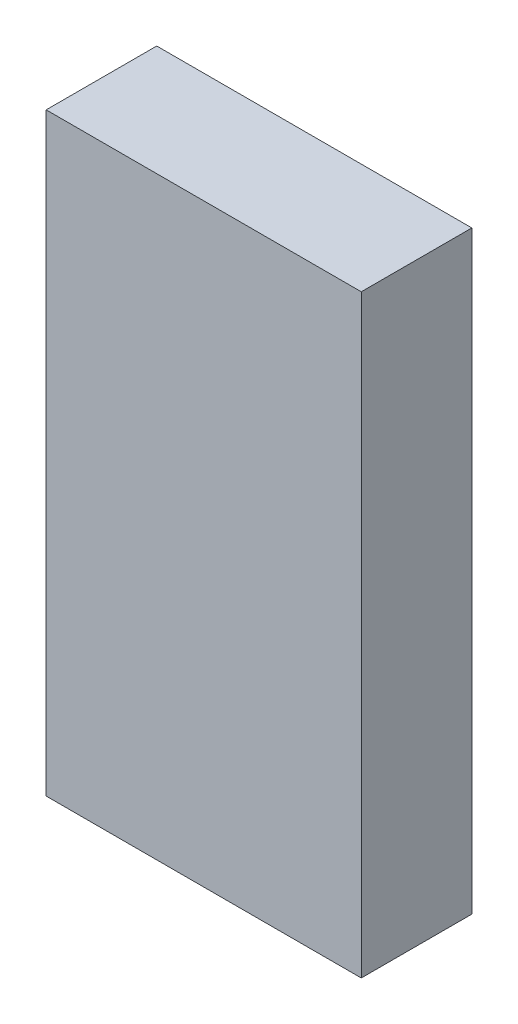
ISO-10303-21;
HEADER;
FILE_DESCRIPTION(('STEP AP214'),'2;1');
FILE_NAME('part.step','',(''),(''),'','','');
FILE_SCHEMA(('AUTOMOTIVE_DESIGN { 1 0 10303 214 1 1 1 1 }'));
ENDSEC;
DATA;
#1=APPLICATION_CONTEXT('core data for automotive mechanical design processes');
#2=APPLICATION_PROTOCOL_DEFINITION('international standard','automotive_design',2000,#1);
#3=PRODUCT_CONTEXT('',#1,'mechanical');
#4=PRODUCT('Part','Part','',(#3));
#5=PRODUCT_RELATED_PRODUCT_CATEGORY('part','',(#4));
#6=PRODUCT_DEFINITION_FORMATION('','',#4);
#7=PRODUCT_DEFINITION_CONTEXT('part definition',#1,'design');
#8=PRODUCT_DEFINITION('design','',#6,#7);
#9=PRODUCT_DEFINITION_SHAPE('','',#8);
#10=(LENGTH_UNIT() NAMED_UNIT(*) SI_UNIT(.MILLI.,.METRE.));
#11=(NAMED_UNIT(*) PLANE_ANGLE_UNIT() SI_UNIT($,.RADIAN.));
#12=(NAMED_UNIT(*) SI_UNIT($,.STERADIAN.) SOLID_ANGLE_UNIT());
#13=UNCERTAINTY_MEASURE_WITH_UNIT(LENGTH_MEASURE(1.E-05),#10,'distance_accuracy_value','');
#14=(GEOMETRIC_REPRESENTATION_CONTEXT(3) GLOBAL_UNCERTAINTY_ASSIGNED_CONTEXT((#13)) GLOBAL_UNIT_ASSIGNED_CONTEXT((#10,
#11,#12)) REPRESENTATION_CONTEXT('',''));
#15=CARTESIAN_POINT('',(0.,0.,0.));
#16=DIRECTION('',(0.,0.,1.));
#17=DIRECTION('',(1.,0.,0.));
#18=AXIS2_PLACEMENT_3D('',#15,#16,#17);
#19=CARTESIAN_POINT('',(57.,107.5,40.));
#20=DIRECTION('',(-1.,0.,0.));
#21=DIRECTION('',(0.,-1.,0.));
#22=AXIS2_PLACEMENT_3D('',#19,#20,#21);
#23=PLANE('',#22);
#24=DIRECTION('',(0.,1.,0.));
#25=VECTOR('',#24,1.);
#26=CARTESIAN_POINT('',(57.,107.5,0.));
#27=LINE('',#26,#25);
#28=CARTESIAN_POINT('',(57.,-107.5,0.));
#29=VERTEX_POINT('',#28);
#30=CARTESIAN_POINT('',(57.,107.5,0.));
#31=VERTEX_POINT('',#30);
#32=EDGE_CURVE('E102',#29,#31,#27,.T.);
#33=ORIENTED_EDGE('',*,*,#32,.T.);
#34=DIRECTION('',(0.,0.,-1.));
#35=VECTOR('',#34,1.);
#36=CARTESIAN_POINT('',(57.,107.5,40.));
#37=LINE('',#36,#35);
#38=CARTESIAN_POINT('',(57.,107.5,40.));
#39=VERTEX_POINT('',#38);
#40=EDGE_CURVE('E12',#39,#31,#37,.T.);
#41=ORIENTED_EDGE('',*,*,#40,.F.);
#42=DIRECTION('',(0.,1.,0.));
#43=VECTOR('',#42,1.);
#44=CARTESIAN_POINT('',(57.,107.5,40.));
#45=LINE('',#44,#43);
#46=CARTESIAN_POINT('',(57.,-107.5,40.));
#47=VERTEX_POINT('',#46);
#48=EDGE_CURVE('E90',#47,#39,#45,.T.);
#49=ORIENTED_EDGE('',*,*,#48,.F.);
#50=DIRECTION('',(0.,0.,-1.));
#51=VECTOR('',#50,1.);
#52=CARTESIAN_POINT('',(57.,-107.5,40.));
#53=LINE('',#52,#51);
#54=EDGE_CURVE('E98',#47,#29,#53,.T.);
#55=ORIENTED_EDGE('',*,*,#54,.T.);
#56=EDGE_LOOP('',(#33,#41,#49,#55));
#57=FACE_BOUND('',#56,.T.);
#58=ADVANCED_FACE('F39',(#57),#23,.F.);
#59=CARTESIAN_POINT('',(-57.,107.5,40.));
#60=DIRECTION('',(0.,-1.,0.));
#61=DIRECTION('',(0.,0.,-1.));
#62=AXIS2_PLACEMENT_3D('',#59,#60,#61);
#63=PLANE('',#62);
#64=DIRECTION('',(-1.,0.,0.));
#65=VECTOR('',#64,1.);
#66=CARTESIAN_POINT('',(-57.,107.5,0.));
#67=LINE('',#66,#65);
#68=CARTESIAN_POINT('',(-57.,107.5,0.));
#69=VERTEX_POINT('',#68);
#70=EDGE_CURVE('E94',#31,#69,#67,.T.);
#71=ORIENTED_EDGE('',*,*,#70,.T.);
#72=DIRECTION('',(0.,0.,-1.));
#73=VECTOR('',#72,1.);
#74=CARTESIAN_POINT('',(-57.,107.5,40.));
#75=LINE('',#74,#73);
#76=CARTESIAN_POINT('',(-57.,107.5,40.));
#77=VERTEX_POINT('',#76);
#78=EDGE_CURVE('E47',#77,#69,#75,.T.);
#79=ORIENTED_EDGE('',*,*,#78,.F.);
#80=DIRECTION('',(-1.,0.,0.));
#81=VECTOR('',#80,1.);
#82=CARTESIAN_POINT('',(-57.,107.5,40.));
#83=LINE('',#82,#81);
#84=EDGE_CURVE('E85',#39,#77,#83,.T.);
#85=ORIENTED_EDGE('',*,*,#84,.F.);
#86=ORIENTED_EDGE('',*,*,#40,.T.);
#87=EDGE_LOOP('',(#71,#79,#85,#86));
#88=FACE_BOUND('',#87,.T.);
#89=ADVANCED_FACE('F93',(#88),#63,.F.);
#90=CARTESIAN_POINT('',(-57.,107.5,40.));
#91=DIRECTION('',(1.,0.,0.));
#92=DIRECTION('',(0.,1.,0.));
#93=AXIS2_PLACEMENT_3D('',#90,#91,#92);
#94=PLANE('',#93);
#95=DIRECTION('',(0.,-1.,0.));
#96=VECTOR('',#95,1.);
#97=CARTESIAN_POINT('',(-57.,107.5,0.));
#98=LINE('',#97,#96);
#99=CARTESIAN_POINT('',(-57.,-107.5,0.));
#100=VERTEX_POINT('',#99);
#101=EDGE_CURVE('E72',#69,#100,#98,.T.);
#102=ORIENTED_EDGE('',*,*,#101,.T.);
#103=DIRECTION('',(0.,0.,-1.));
#104=VECTOR('',#103,1.);
#105=CARTESIAN_POINT('',(-57.,-107.5,40.));
#106=LINE('',#105,#104);
#107=CARTESIAN_POINT('',(-57.,-107.5,40.));
#108=VERTEX_POINT('',#107);
#109=EDGE_CURVE('E95',#108,#100,#106,.T.);
#110=ORIENTED_EDGE('',*,*,#109,.F.);
#111=DIRECTION('',(0.,-1.,0.));
#112=VECTOR('',#111,1.);
#113=CARTESIAN_POINT('',(-57.,107.5,40.));
#114=LINE('',#113,#112);
#115=EDGE_CURVE('E88',#77,#108,#114,.T.);
#116=ORIENTED_EDGE('',*,*,#115,.F.);
#117=ORIENTED_EDGE('',*,*,#78,.T.);
#118=EDGE_LOOP('',(#102,#110,#116,#117));
#119=FACE_BOUND('',#118,.T.);
#120=ADVANCED_FACE('F96',(#119),#94,.F.);
#121=CARTESIAN_POINT('',(-57.,-107.5,40.));
#122=DIRECTION('',(0.,1.,0.));
#123=DIRECTION('',(0.,0.,1.));
#124=AXIS2_PLACEMENT_3D('',#121,#122,#123);
#125=PLANE('',#124);
#126=DIRECTION('',(1.,0.,0.));
#127=VECTOR('',#126,1.);
#128=CARTESIAN_POINT('',(-57.,-107.5,0.));
#129=LINE('',#128,#127);
#130=EDGE_CURVE('E78',#100,#29,#129,.T.);
#131=ORIENTED_EDGE('',*,*,#130,.T.);
#132=ORIENTED_EDGE('',*,*,#54,.F.);
#133=DIRECTION('',(1.,0.,0.));
#134=VECTOR('',#133,1.);
#135=CARTESIAN_POINT('',(-57.,-107.5,40.));
#136=LINE('',#135,#134);
#137=EDGE_CURVE('E55',#108,#47,#136,.T.);
#138=ORIENTED_EDGE('',*,*,#137,.F.);
#139=ORIENTED_EDGE('',*,*,#109,.T.);
#140=EDGE_LOOP('',(#131,#132,#138,#139));
#141=FACE_BOUND('',#140,.T.);
#142=ADVANCED_FACE('F120',(#141),#125,.F.);
#143=CARTESIAN_POINT('',(0.,0.,40.));
#144=DIRECTION('',(0.,0.,1.));
#145=DIRECTION('',(1.,0.,0.));
#146=AXIS2_PLACEMENT_3D('',#143,#144,#145);
#147=PLANE('',#146);
#148=ORIENTED_EDGE('',*,*,#48,.T.);
#149=ORIENTED_EDGE('',*,*,#84,.T.);
#150=ORIENTED_EDGE('',*,*,#115,.T.);
#151=ORIENTED_EDGE('',*,*,#137,.T.);
#152=EDGE_LOOP('',(#148,#149,#150,#151));
#153=FACE_BOUND('',#152,.T.);
#154=ADVANCED_FACE('F86',(#153),#147,.T.);
#155=CARTESIAN_POINT('',(0.,0.,0.));
#156=DIRECTION('',(0.,0.,1.));
#157=DIRECTION('',(1.,0.,0.));
#158=AXIS2_PLACEMENT_3D('',#155,#156,#157);
#159=PLANE('',#158);
#160=CARTESIAN_POINT('',(25.,-75.,0.));
#161=DIRECTION('',(0.,0.,-1.));
#162=DIRECTION('',(-1.,0.,0.));
#163=AXIS2_PLACEMENT_3D('',#160,#161,#162);
#164=CIRCLE('',#163,2.5);
#165=CARTESIAN_POINT('',(22.5,-75.,0.));
#166=VERTEX_POINT('',#165);
#167=EDGE_CURVE('E133',#166,#166,#164,.T.);
#168=ORIENTED_EDGE('',*,*,#167,.F.);
#169=EDGE_LOOP('',(#168));
#170=FACE_BOUND('',#169,.T.);
#171=CARTESIAN_POINT('',(-25.,-75.,0.));
#172=DIRECTION('',(0.,0.,-1.));
#173=DIRECTION('',(-1.,0.,0.));
#174=AXIS2_PLACEMENT_3D('',#171,#172,#173);
#175=CIRCLE('',#174,2.5);
#176=CARTESIAN_POINT('',(-27.5,-75.,0.));
#177=VERTEX_POINT('',#176);
#178=EDGE_CURVE('E143',#177,#177,#175,.T.);
#179=ORIENTED_EDGE('',*,*,#178,.F.);
#180=EDGE_LOOP('',(#179));
#181=FACE_BOUND('',#180,.T.);
#182=CARTESIAN_POINT('',(-25.,75.,0.));
#183=DIRECTION('',(0.,0.,-1.));
#184=DIRECTION('',(-1.,0.,0.));
#185=AXIS2_PLACEMENT_3D('',#182,#183,#184);
#186=CIRCLE('',#185,2.5);
#187=CARTESIAN_POINT('',(-27.5,75.,0.));
#188=VERTEX_POINT('',#187);
#189=EDGE_CURVE('E150',#188,#188,#186,.T.);
#190=ORIENTED_EDGE('',*,*,#189,.F.);
#191=EDGE_LOOP('',(#190));
#192=FACE_BOUND('',#191,.T.);
#193=CARTESIAN_POINT('',(25.,75.,0.));
#194=DIRECTION('',(0.,0.,-1.));
#195=DIRECTION('',(-1.,0.,0.));
#196=AXIS2_PLACEMENT_3D('',#193,#194,#195);
#197=CIRCLE('',#196,2.5);
#198=CARTESIAN_POINT('',(22.5,75.,0.));
#199=VERTEX_POINT('',#198);
#200=EDGE_CURVE('E125',#199,#199,#197,.T.);
#201=ORIENTED_EDGE('',*,*,#200,.F.);
#202=EDGE_LOOP('',(#201));
#203=FACE_BOUND('',#202,.T.);
#204=ORIENTED_EDGE('',*,*,#32,.F.);
#205=ORIENTED_EDGE('',*,*,#130,.F.);
#206=ORIENTED_EDGE('',*,*,#101,.F.);
#207=ORIENTED_EDGE('',*,*,#70,.F.);
#208=EDGE_LOOP('',(#204,#205,#206,#207));
#209=FACE_BOUND('',#208,.T.);
#210=ADVANCED_FACE('F123',(#170,#181,#192,#203,#209),#159,.F.);
#211=CARTESIAN_POINT('',(25.,75.,30.));
#212=DIRECTION('',(0.,0.,-1.));
#213=DIRECTION('',(-1.,0.,0.));
#214=AXIS2_PLACEMENT_3D('',#211,#212,#213);
#215=CYLINDRICAL_SURFACE('',#214,2.5);
#216=CARTESIAN_POINT('',(25.,75.,30.));
#217=DIRECTION('',(0.,0.,-1.));
#218=DIRECTION('',(-1.,0.,0.));
#219=AXIS2_PLACEMENT_3D('',#216,#217,#218);
#220=CIRCLE('',#219,2.5);
#221=CARTESIAN_POINT('',(22.5,75.,30.));
#222=VERTEX_POINT('',#221);
#223=EDGE_CURVE('E106',#222,#222,#220,.T.);
#224=ORIENTED_EDGE('',*,*,#223,.F.);
#225=EDGE_LOOP('',(#224));
#226=FACE_BOUND('',#225,.T.);
#227=ORIENTED_EDGE('',*,*,#200,.T.);
#228=EDGE_LOOP('',(#227));
#229=FACE_BOUND('',#228,.T.);
#230=ADVANCED_FACE('F169',(#226,#229),#215,.F.);
#231=CARTESIAN_POINT('',(25.,75.,30.));
#232=DIRECTION('',(0.,0.,-1.));
#233=DIRECTION('',(-1.,0.,0.));
#234=AXIS2_PLACEMENT_3D('',#231,#232,#233);
#235=PLANE('',#234);
#236=ORIENTED_EDGE('',*,*,#223,.T.);
#237=EDGE_LOOP('',(#236));
#238=FACE_BOUND('',#237,.T.);
#239=ADVANCED_FACE('F163',(#238),#235,.T.);
#240=CARTESIAN_POINT('',(-25.,75.,30.));
#241=DIRECTION('',(0.,0.,-1.));
#242=DIRECTION('',(-1.,0.,0.));
#243=AXIS2_PLACEMENT_3D('',#240,#241,#242);
#244=CYLINDRICAL_SURFACE('',#243,2.5);
#245=CARTESIAN_POINT('',(-25.,75.,30.));
#246=DIRECTION('',(0.,0.,-1.));
#247=DIRECTION('',(-1.,0.,0.));
#248=AXIS2_PLACEMENT_3D('',#245,#246,#247);
#249=CIRCLE('',#248,2.5);
#250=CARTESIAN_POINT('',(-27.5,75.,30.));
#251=VERTEX_POINT('',#250);
#252=EDGE_CURVE('E130',#251,#251,#249,.T.);
#253=ORIENTED_EDGE('',*,*,#252,.F.);
#254=EDGE_LOOP('',(#253));
#255=FACE_BOUND('',#254,.T.);
#256=ORIENTED_EDGE('',*,*,#189,.T.);
#257=EDGE_LOOP('',(#256));
#258=FACE_BOUND('',#257,.T.);
#259=ADVANCED_FACE('F160',(#255,#258),#244,.F.);
#260=CARTESIAN_POINT('',(-25.,75.,30.));
#261=DIRECTION('',(0.,0.,-1.));
#262=DIRECTION('',(-1.,0.,0.));
#263=AXIS2_PLACEMENT_3D('',#260,#261,#262);
#264=PLANE('',#263);
#265=ORIENTED_EDGE('',*,*,#252,.T.);
#266=EDGE_LOOP('',(#265));
#267=FACE_BOUND('',#266,.T.);
#268=ADVANCED_FACE('F158',(#267),#264,.T.);
#269=CARTESIAN_POINT('',(-25.,-75.,30.));
#270=DIRECTION('',(0.,0.,-1.));
#271=DIRECTION('',(-1.,0.,0.));
#272=AXIS2_PLACEMENT_3D('',#269,#270,#271);
#273=CYLINDRICAL_SURFACE('',#272,2.5);
#274=CARTESIAN_POINT('',(-25.,-75.,30.));
#275=DIRECTION('',(0.,0.,-1.));
#276=DIRECTION('',(-1.,0.,0.));
#277=AXIS2_PLACEMENT_3D('',#274,#275,#276);
#278=CIRCLE('',#277,2.5);
#279=CARTESIAN_POINT('',(-27.5,-75.,30.));
#280=VERTEX_POINT('',#279);
#281=EDGE_CURVE('E148',#280,#280,#278,.T.);
#282=ORIENTED_EDGE('',*,*,#281,.F.);
#283=EDGE_LOOP('',(#282));
#284=FACE_BOUND('',#283,.T.);
#285=ORIENTED_EDGE('',*,*,#178,.T.);
#286=EDGE_LOOP('',(#285));
#287=FACE_BOUND('',#286,.T.);
#288=ADVANCED_FACE('F228',(#284,#287),#273,.F.);
#289=CARTESIAN_POINT('',(-25.,-75.,30.));
#290=DIRECTION('',(0.,0.,-1.));
#291=DIRECTION('',(-1.,0.,0.));
#292=AXIS2_PLACEMENT_3D('',#289,#290,#291);
#293=PLANE('',#292);
#294=ORIENTED_EDGE('',*,*,#281,.T.);
#295=EDGE_LOOP('',(#294));
#296=FACE_BOUND('',#295,.T.);
#297=ADVANCED_FACE('F237',(#296),#293,.T.);
#298=CARTESIAN_POINT('',(25.,-75.,30.));
#299=DIRECTION('',(0.,0.,-1.));
#300=DIRECTION('',(-1.,0.,0.));
#301=AXIS2_PLACEMENT_3D('',#298,#299,#300);
#302=CYLINDRICAL_SURFACE('',#301,2.5);
#303=CARTESIAN_POINT('',(25.,-75.,30.));
#304=DIRECTION('',(0.,0.,-1.));
#305=DIRECTION('',(-1.,0.,0.));
#306=AXIS2_PLACEMENT_3D('',#303,#304,#305);
#307=CIRCLE('',#306,2.5);
#308=CARTESIAN_POINT('',(22.5,-75.,30.));
#309=VERTEX_POINT('',#308);
#310=EDGE_CURVE('E138',#309,#309,#307,.T.);
#311=ORIENTED_EDGE('',*,*,#310,.F.);
#312=EDGE_LOOP('',(#311));
#313=FACE_BOUND('',#312,.T.);
#314=ORIENTED_EDGE('',*,*,#167,.T.);
#315=EDGE_LOOP('',(#314));
#316=FACE_BOUND('',#315,.T.);
#317=ADVANCED_FACE('F247',(#313,#316),#302,.F.);
#318=CARTESIAN_POINT('',(25.,-75.,30.));
#319=DIRECTION('',(0.,0.,-1.));
#320=DIRECTION('',(-1.,0.,0.));
#321=AXIS2_PLACEMENT_3D('',#318,#319,#320);
#322=PLANE('',#321);
#323=ORIENTED_EDGE('',*,*,#310,.T.);
#324=EDGE_LOOP('',(#323));
#325=FACE_BOUND('',#324,.T.);
#326=ADVANCED_FACE('F257',(#325),#322,.T.);
#327=CLOSED_SHELL('',(#58,#89,#120,#142,#154,#210,#230,#239,#259,#268,#288,#297,#317,#326));
#328=MANIFOLD_SOLID_BREP('B2',#327);
#329=ADVANCED_BREP_SHAPE_REPRESENTATION('',(#18,#328),#14);
#330=SHAPE_DEFINITION_REPRESENTATION(#9,#329);
ENDSEC;
END-ISO-10303-21;
